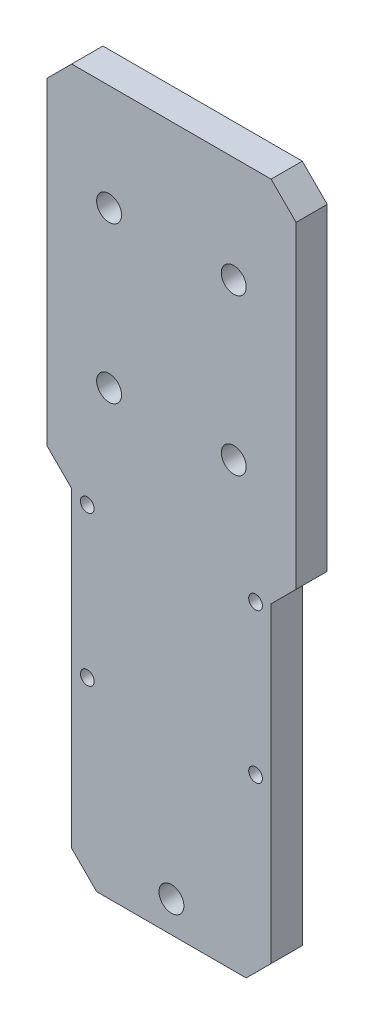
ISO-10303-21;
HEADER;
FILE_DESCRIPTION(('STEP AP214'),'2;1');
FILE_NAME('part.step','',(''),(''),'','','');
FILE_SCHEMA(('AUTOMOTIVE_DESIGN { 1 0 10303 214 1 1 1 1 }'));
ENDSEC;
DATA;
#1=APPLICATION_CONTEXT('core data for automotive mechanical design processes');
#2=APPLICATION_PROTOCOL_DEFINITION('international standard','automotive_design',2000,#1);
#3=PRODUCT_CONTEXT('',#1,'mechanical');
#4=PRODUCT('Part','Part','',(#3));
#5=PRODUCT_RELATED_PRODUCT_CATEGORY('part','',(#4));
#6=PRODUCT_DEFINITION_FORMATION('','',#4);
#7=PRODUCT_DEFINITION_CONTEXT('part definition',#1,'design');
#8=PRODUCT_DEFINITION('design','',#6,#7);
#9=PRODUCT_DEFINITION_SHAPE('','',#8);
#10=(LENGTH_UNIT() NAMED_UNIT(*) SI_UNIT(.MILLI.,.METRE.));
#11=(NAMED_UNIT(*) PLANE_ANGLE_UNIT() SI_UNIT($,.RADIAN.));
#12=(NAMED_UNIT(*) SI_UNIT($,.STERADIAN.) SOLID_ANGLE_UNIT());
#13=UNCERTAINTY_MEASURE_WITH_UNIT(LENGTH_MEASURE(1.E-05),#10,'distance_accuracy_value','');
#14=(GEOMETRIC_REPRESENTATION_CONTEXT(3) GLOBAL_UNCERTAINTY_ASSIGNED_CONTEXT((#13)) GLOBAL_UNIT_ASSIGNED_CONTEXT((#10,
#11,#12)) REPRESENTATION_CONTEXT('',''));
#15=CARTESIAN_POINT('',(0.,0.,0.));
#16=DIRECTION('',(0.,0.,1.));
#17=DIRECTION('',(1.,0.,0.));
#18=AXIS2_PLACEMENT_3D('',#15,#16,#17);
#19=CARTESIAN_POINT('',(0.,0.,5.));
#20=DIRECTION('',(0.,0.,1.));
#21=DIRECTION('',(1.,0.,0.));
#22=AXIS2_PLACEMENT_3D('',#19,#20,#21);
#23=PLANE('',#22);
#24=CARTESIAN_POINT('',(0.,-80.5,5.));
#25=DIRECTION('',(0.,0.,1.));
#26=DIRECTION('',(1.,0.,0.));
#27=AXIS2_PLACEMENT_3D('',#24,#25,#26);
#28=CIRCLE('',#27,2.);
#29=CARTESIAN_POINT('',(2.,-80.5,5.));
#30=VERTEX_POINT('',#29);
#31=EDGE_CURVE('E169',#30,#30,#28,.T.);
#32=ORIENTED_EDGE('',*,*,#31,.F.);
#33=EDGE_LOOP('',(#32));
#34=FACE_BOUND('',#33,.T.);
#35=CARTESIAN_POINT('',(-10.000556095379,-14.500556095379,5.));
#36=DIRECTION('',(0.,0.,-1.));
#37=DIRECTION('',(-1.,0.,0.));
#38=AXIS2_PLACEMENT_3D('',#35,#36,#37);
#39=CIRCLE('',#38,2.);
#40=CARTESIAN_POINT('',(-12.000556095379,-14.500556095379,5.));
#41=VERTEX_POINT('',#40);
#42=EDGE_CURVE('E206',#41,#41,#39,.T.);
#43=ORIENTED_EDGE('',*,*,#42,.T.);
#44=EDGE_LOOP('',(#43));
#45=FACE_BOUND('',#44,.T.);
#46=CARTESIAN_POINT('',(-10.000556095379,10.499443904621,5.));
#47=DIRECTION('',(0.,0.,-1.));
#48=DIRECTION('',(-1.,0.,0.));
#49=AXIS2_PLACEMENT_3D('',#46,#47,#48);
#50=CIRCLE('',#49,2.);
#51=CARTESIAN_POINT('',(-12.000556095379,10.499443904621,5.));
#52=VERTEX_POINT('',#51);
#53=EDGE_CURVE('E193',#52,#52,#50,.T.);
#54=ORIENTED_EDGE('',*,*,#53,.T.);
#55=EDGE_LOOP('',(#54));
#56=FACE_BOUND('',#55,.T.);
#57=DIRECTION('',(0.707106781186552,0.707106781186544,0.));
#58=VECTOR('',#57,1.);
#59=CARTESIAN_POINT('',(-20.,23.4977756184842,5.));
#60=LINE('',#59,#58);
#61=CARTESIAN_POINT('',(-20.,23.4977756184842,5.));
#62=VERTEX_POINT('',#61);
#63=CARTESIAN_POINT('',(-15.9977756184841,27.5,5.));
#64=VERTEX_POINT('',#63);
#65=EDGE_CURVE('E225',#62,#64,#60,.T.);
#66=ORIENTED_EDGE('',*,*,#65,.F.);
#67=DIRECTION('',(0.,-1.,0.));
#68=VECTOR('',#67,1.);
#69=CARTESIAN_POINT('',(-20.,0.,5.));
#70=LINE('',#69,#68);
#71=CARTESIAN_POINT('',(-20.,-27.5,5.));
#72=VERTEX_POINT('',#71);
#73=EDGE_CURVE('E251',#62,#72,#70,.T.);
#74=ORIENTED_EDGE('',*,*,#73,.T.);
#75=DIRECTION('',(0.707106781186546,-0.707106781186549,0.));
#76=VECTOR('',#75,1.);
#77=CARTESIAN_POINT('',(-23.75,-23.75,5.));
#78=LINE('',#77,#76);
#79=CARTESIAN_POINT('',(-16.,-31.5,5.));
#80=VERTEX_POINT('',#79);
#81=EDGE_CURVE('E254',#72,#80,#78,.T.);
#82=ORIENTED_EDGE('',*,*,#81,.T.);
#83=DIRECTION('',(0.,1.,0.));
#84=VECTOR('',#83,1.);
#85=CARTESIAN_POINT('',(-16.,0.,5.));
#86=LINE('',#85,#84);
#87=CARTESIAN_POINT('',(-16.,-81.4977756184842,5.));
#88=VERTEX_POINT('',#87);
#89=EDGE_CURVE('E257',#88,#80,#86,.T.);
#90=ORIENTED_EDGE('',*,*,#89,.F.);
#91=DIRECTION('',(0.707106781186556,-0.707106781186539,0.));
#92=VECTOR('',#91,1.);
#93=CARTESIAN_POINT('',(-48.7488878092419,-48.7488878092431,5.));
#94=LINE('',#93,#92);
#95=CARTESIAN_POINT('',(-11.9977756184841,-85.5,5.));
#96=VERTEX_POINT('',#95);
#97=EDGE_CURVE('E163',#88,#96,#94,.T.);
#98=ORIENTED_EDGE('',*,*,#97,.T.);
#99=DIRECTION('',(1.,0.,0.));
#100=VECTOR('',#99,1.);
#101=CARTESIAN_POINT('',(0.,-85.5,5.));
#102=LINE('',#101,#100);
#103=CARTESIAN_POINT('',(11.9977756184841,-85.5,5.));
#104=VERTEX_POINT('',#103);
#105=EDGE_CURVE('E174',#96,#104,#102,.T.);
#106=ORIENTED_EDGE('',*,*,#105,.T.);
#107=DIRECTION('',(-0.707106781186556,-0.707106781186539,0.));
#108=VECTOR('',#107,1.);
#109=CARTESIAN_POINT('',(48.7488878092419,-48.7488878092431,5.));
#110=LINE('',#109,#108);
#111=CARTESIAN_POINT('',(16.,-81.4977756184842,5.));
#112=VERTEX_POINT('',#111);
#113=EDGE_CURVE('E153',#112,#104,#110,.T.);
#114=ORIENTED_EDGE('',*,*,#113,.F.);
#115=DIRECTION('',(0.,1.,0.));
#116=VECTOR('',#115,1.);
#117=CARTESIAN_POINT('',(16.,0.,5.));
#118=LINE('',#117,#116);
#119=CARTESIAN_POINT('',(16.,-31.5,5.));
#120=VERTEX_POINT('',#119);
#121=EDGE_CURVE('E261',#112,#120,#118,.T.);
#122=ORIENTED_EDGE('',*,*,#121,.T.);
#123=DIRECTION('',(-0.707106781186546,-0.707106781186549,0.));
#124=VECTOR('',#123,1.);
#125=CARTESIAN_POINT('',(23.75,-23.75,5.));
#126=LINE('',#125,#124);
#127=CARTESIAN_POINT('',(20.,-27.5,5.));
#128=VERTEX_POINT('',#127);
#129=EDGE_CURVE('E264',#128,#120,#126,.T.);
#130=ORIENTED_EDGE('',*,*,#129,.F.);
#131=DIRECTION('',(0.,-1.,0.));
#132=VECTOR('',#131,1.);
#133=CARTESIAN_POINT('',(20.,0.,5.));
#134=LINE('',#133,#132);
#135=CARTESIAN_POINT('',(20.,23.4977756184842,5.));
#136=VERTEX_POINT('',#135);
#137=EDGE_CURVE('E243',#136,#128,#134,.T.);
#138=ORIENTED_EDGE('',*,*,#137,.F.);
#139=DIRECTION('',(0.707106781186552,-0.707106781186544,0.));
#140=VECTOR('',#139,1.);
#141=CARTESIAN_POINT('',(20.,23.4977756184842,5.));
#142=LINE('',#141,#140);
#143=CARTESIAN_POINT('',(15.9977756184841,27.5,5.));
#144=VERTEX_POINT('',#143);
#145=EDGE_CURVE('E217',#144,#136,#142,.T.);
#146=ORIENTED_EDGE('',*,*,#145,.F.);
#147=DIRECTION('',(1.,0.,0.));
#148=VECTOR('',#147,1.);
#149=CARTESIAN_POINT('',(0.,27.5,5.));
#150=LINE('',#149,#148);
#151=EDGE_CURVE('E246',#64,#144,#150,.T.);
#152=ORIENTED_EDGE('',*,*,#151,.F.);
#153=EDGE_LOOP('',(#66,#74,#82,#90,#98,#106,#114,#122,#130,#138,#146,#152));
#154=FACE_BOUND('',#153,.T.);
#155=CARTESIAN_POINT('',(13.5,-32.5,5.));
#156=DIRECTION('',(0.,0.,1.));
#157=DIRECTION('',(1.,0.,0.));
#158=AXIS2_PLACEMENT_3D('',#155,#156,#157);
#159=CIRCLE('',#158,1.1);
#160=CARTESIAN_POINT('',(14.6,-32.5,5.));
#161=VERTEX_POINT('',#160);
#162=EDGE_CURVE('E268',#161,#161,#159,.F.);
#163=ORIENTED_EDGE('',*,*,#162,.T.);
#164=EDGE_LOOP('',(#163));
#165=FACE_BOUND('',#164,.T.);
#166=CARTESIAN_POINT('',(13.4999999999998,-56.5,5.));
#167=DIRECTION('',(0.,0.,1.));
#168=DIRECTION('',(1.,0.,0.));
#169=AXIS2_PLACEMENT_3D('',#166,#167,#168);
#170=CIRCLE('',#169,1.10000000000001);
#171=CARTESIAN_POINT('',(14.5999999999998,-56.5,5.));
#172=VERTEX_POINT('',#171);
#173=EDGE_CURVE('E272',#172,#172,#170,.F.);
#174=ORIENTED_EDGE('',*,*,#173,.T.);
#175=EDGE_LOOP('',(#174));
#176=FACE_BOUND('',#175,.T.);
#177=CARTESIAN_POINT('',(-13.4999999999997,-56.5,5.));
#178=DIRECTION('',(0.,0.,1.));
#179=DIRECTION('',(1.,0.,0.));
#180=AXIS2_PLACEMENT_3D('',#177,#178,#179);
#181=CIRCLE('',#180,1.10000000000001);
#182=CARTESIAN_POINT('',(-12.3999999999997,-56.5,5.));
#183=VERTEX_POINT('',#182);
#184=EDGE_CURVE('E276',#183,#183,#181,.T.);
#185=ORIENTED_EDGE('',*,*,#184,.F.);
#186=EDGE_LOOP('',(#185));
#187=FACE_BOUND('',#186,.T.);
#188=CARTESIAN_POINT('',(-13.5,-32.5,5.));
#189=DIRECTION('',(0.,0.,1.));
#190=DIRECTION('',(1.,0.,0.));
#191=AXIS2_PLACEMENT_3D('',#188,#189,#190);
#192=CIRCLE('',#191,1.1);
#193=CARTESIAN_POINT('',(-12.4,-32.5,5.));
#194=VERTEX_POINT('',#193);
#195=EDGE_CURVE('E280',#194,#194,#192,.T.);
#196=ORIENTED_EDGE('',*,*,#195,.F.);
#197=EDGE_LOOP('',(#196));
#198=FACE_BOUND('',#197,.T.);
#199=CARTESIAN_POINT('',(10.000556095379,10.499443904621,5.));
#200=DIRECTION('',(0.,0.,1.));
#201=DIRECTION('',(1.,0.,0.));
#202=AXIS2_PLACEMENT_3D('',#199,#200,#201);
#203=CIRCLE('',#202,2.);
#204=CARTESIAN_POINT('',(12.000556095379,10.499443904621,5.));
#205=VERTEX_POINT('',#204);
#206=EDGE_CURVE('E189',#205,#205,#203,.T.);
#207=ORIENTED_EDGE('',*,*,#206,.F.);
#208=EDGE_LOOP('',(#207));
#209=FACE_BOUND('',#208,.T.);
#210=CARTESIAN_POINT('',(10.000556095379,-14.500556095379,5.));
#211=DIRECTION('',(0.,0.,1.));
#212=DIRECTION('',(1.,0.,0.));
#213=AXIS2_PLACEMENT_3D('',#210,#211,#212);
#214=CIRCLE('',#213,2.);
#215=CARTESIAN_POINT('',(12.000556095379,-14.500556095379,5.));
#216=VERTEX_POINT('',#215);
#217=EDGE_CURVE('E198',#216,#216,#214,.T.);
#218=ORIENTED_EDGE('',*,*,#217,.F.);
#219=EDGE_LOOP('',(#218));
#220=FACE_BOUND('',#219,.T.);
#221=ADVANCED_FACE('F41',(#34,#45,#56,#154,#165,#176,#187,#198,#209,#220),#23,.T.);
#222=CARTESIAN_POINT('',(0.,0.,0.));
#223=DIRECTION('',(0.,0.,1.));
#224=DIRECTION('',(1.,0.,0.));
#225=AXIS2_PLACEMENT_3D('',#222,#223,#224);
#226=PLANE('',#225);
#227=CARTESIAN_POINT('',(0.,-80.5,0.));
#228=DIRECTION('',(0.,0.,1.));
#229=DIRECTION('',(1.,0.,0.));
#230=AXIS2_PLACEMENT_3D('',#227,#228,#229);
#231=CIRCLE('',#230,2.);
#232=CARTESIAN_POINT('',(2.,-80.5,0.));
#233=VERTEX_POINT('',#232);
#234=EDGE_CURVE('E177',#233,#233,#231,.T.);
#235=ORIENTED_EDGE('',*,*,#234,.T.);
#236=EDGE_LOOP('',(#235));
#237=FACE_BOUND('',#236,.T.);
#238=CARTESIAN_POINT('',(-10.000556095379,-14.500556095379,0.));
#239=DIRECTION('',(0.,0.,-1.));
#240=DIRECTION('',(-1.,0.,0.));
#241=AXIS2_PLACEMENT_3D('',#238,#239,#240);
#242=CIRCLE('',#241,2.);
#243=CARTESIAN_POINT('',(-12.000556095379,-14.500556095379,0.));
#244=VERTEX_POINT('',#243);
#245=EDGE_CURVE('E182',#244,#244,#242,.T.);
#246=ORIENTED_EDGE('',*,*,#245,.F.);
#247=EDGE_LOOP('',(#246));
#248=FACE_BOUND('',#247,.T.);
#249=CARTESIAN_POINT('',(10.000556095379,10.499443904621,0.));
#250=DIRECTION('',(0.,0.,1.));
#251=DIRECTION('',(1.,0.,0.));
#252=AXIS2_PLACEMENT_3D('',#249,#250,#251);
#253=CIRCLE('',#252,2.);
#254=CARTESIAN_POINT('',(12.000556095379,10.499443904621,0.));
#255=VERTEX_POINT('',#254);
#256=EDGE_CURVE('E194',#255,#255,#253,.T.);
#257=ORIENTED_EDGE('',*,*,#256,.T.);
#258=EDGE_LOOP('',(#257));
#259=FACE_BOUND('',#258,.T.);
#260=CARTESIAN_POINT('',(-10.000556095379,10.499443904621,0.));
#261=DIRECTION('',(0.,0.,-1.));
#262=DIRECTION('',(-1.,0.,0.));
#263=AXIS2_PLACEMENT_3D('',#260,#261,#262);
#264=CIRCLE('',#263,2.);
#265=CARTESIAN_POINT('',(-12.000556095379,10.499443904621,0.));
#266=VERTEX_POINT('',#265);
#267=EDGE_CURVE('E213',#266,#266,#264,.T.);
#268=ORIENTED_EDGE('',*,*,#267,.F.);
#269=EDGE_LOOP('',(#268));
#270=FACE_BOUND('',#269,.T.);
#271=DIRECTION('',(0.,-1.,0.));
#272=VECTOR('',#271,1.);
#273=CARTESIAN_POINT('',(-20.,0.,0.));
#274=LINE('',#273,#272);
#275=CARTESIAN_POINT('',(-20.,23.4977756184842,0.));
#276=VERTEX_POINT('',#275);
#277=CARTESIAN_POINT('',(-20.,-27.5,0.));
#278=VERTEX_POINT('',#277);
#279=EDGE_CURVE('E291',#276,#278,#274,.T.);
#280=ORIENTED_EDGE('',*,*,#279,.F.);
#281=DIRECTION('',(0.707106781186552,0.707106781186544,0.));
#282=VECTOR('',#281,1.);
#283=CARTESIAN_POINT('',(-20.,23.4977756184842,0.));
#284=LINE('',#283,#282);
#285=CARTESIAN_POINT('',(-15.9977756184841,27.5,0.));
#286=VERTEX_POINT('',#285);
#287=EDGE_CURVE('E221',#276,#286,#284,.T.);
#288=ORIENTED_EDGE('',*,*,#287,.T.);
#289=DIRECTION('',(1.,0.,0.));
#290=VECTOR('',#289,1.);
#291=CARTESIAN_POINT('',(0.,27.5,0.));
#292=LINE('',#291,#290);
#293=CARTESIAN_POINT('',(15.9977756184841,27.5,0.));
#294=VERTEX_POINT('',#293);
#295=EDGE_CURVE('E287',#286,#294,#292,.T.);
#296=ORIENTED_EDGE('',*,*,#295,.T.);
#297=DIRECTION('',(0.707106781186552,-0.707106781186544,0.));
#298=VECTOR('',#297,1.);
#299=CARTESIAN_POINT('',(20.,23.4977756184842,0.));
#300=LINE('',#299,#298);
#301=CARTESIAN_POINT('',(20.,23.4977756184842,0.));
#302=VERTEX_POINT('',#301);
#303=EDGE_CURVE('E233',#294,#302,#300,.T.);
#304=ORIENTED_EDGE('',*,*,#303,.T.);
#305=DIRECTION('',(0.,-1.,0.));
#306=VECTOR('',#305,1.);
#307=CARTESIAN_POINT('',(20.,0.,0.));
#308=LINE('',#307,#306);
#309=CARTESIAN_POINT('',(20.,-27.5,0.));
#310=VERTEX_POINT('',#309);
#311=EDGE_CURVE('E230',#302,#310,#308,.T.);
#312=ORIENTED_EDGE('',*,*,#311,.T.);
#313=DIRECTION('',(-0.707106781186546,-0.707106781186549,0.));
#314=VECTOR('',#313,1.);
#315=CARTESIAN_POINT('',(23.75,-23.75,0.));
#316=LINE('',#315,#314);
#317=CARTESIAN_POINT('',(16.,-31.5,0.));
#318=VERTEX_POINT('',#317);
#319=EDGE_CURVE('E304',#310,#318,#316,.T.);
#320=ORIENTED_EDGE('',*,*,#319,.T.);
#321=DIRECTION('',(0.,1.,0.));
#322=VECTOR('',#321,1.);
#323=CARTESIAN_POINT('',(16.,0.,0.));
#324=LINE('',#323,#322);
#325=CARTESIAN_POINT('',(16.,-81.4977756184842,0.));
#326=VERTEX_POINT('',#325);
#327=EDGE_CURVE('E142',#326,#318,#324,.T.);
#328=ORIENTED_EDGE('',*,*,#327,.F.);
#329=DIRECTION('',(-0.707106781186556,-0.707106781186539,0.));
#330=VECTOR('',#329,1.);
#331=CARTESIAN_POINT('',(48.7488878092419,-48.7488878092431,0.));
#332=LINE('',#331,#330);
#333=CARTESIAN_POINT('',(11.9977756184841,-85.5,0.));
#334=VERTEX_POINT('',#333);
#335=EDGE_CURVE('E131',#326,#334,#332,.T.);
#336=ORIENTED_EDGE('',*,*,#335,.T.);
#337=DIRECTION('',(1.,0.,0.));
#338=VECTOR('',#337,1.);
#339=CARTESIAN_POINT('',(0.,-85.5,0.));
#340=LINE('',#339,#338);
#341=CARTESIAN_POINT('',(-11.9977756184841,-85.5,0.));
#342=VERTEX_POINT('',#341);
#343=EDGE_CURVE('E138',#342,#334,#340,.T.);
#344=ORIENTED_EDGE('',*,*,#343,.F.);
#345=DIRECTION('',(0.707106781186556,-0.707106781186539,0.));
#346=VECTOR('',#345,1.);
#347=CARTESIAN_POINT('',(-48.7488878092419,-48.7488878092431,0.));
#348=LINE('',#347,#346);
#349=CARTESIAN_POINT('',(-16.,-81.4977756184842,0.));
#350=VERTEX_POINT('',#349);
#351=EDGE_CURVE('E147',#350,#342,#348,.T.);
#352=ORIENTED_EDGE('',*,*,#351,.F.);
#353=DIRECTION('',(0.,1.,0.));
#354=VECTOR('',#353,1.);
#355=CARTESIAN_POINT('',(-16.,0.,0.));
#356=LINE('',#355,#354);
#357=CARTESIAN_POINT('',(-16.,-31.5,0.));
#358=VERTEX_POINT('',#357);
#359=EDGE_CURVE('E298',#350,#358,#356,.T.);
#360=ORIENTED_EDGE('',*,*,#359,.T.);
#361=DIRECTION('',(0.707106781186546,-0.707106781186549,0.));
#362=VECTOR('',#361,1.);
#363=CARTESIAN_POINT('',(-23.75,-23.75,0.));
#364=LINE('',#363,#362);
#365=EDGE_CURVE('E294',#278,#358,#364,.T.);
#366=ORIENTED_EDGE('',*,*,#365,.F.);
#367=EDGE_LOOP('',(#280,#288,#296,#304,#312,#320,#328,#336,#344,#352,#360,#366));
#368=FACE_BOUND('',#367,.T.);
#369=CARTESIAN_POINT('',(13.5,-32.5,0.));
#370=DIRECTION('',(0.,0.,1.));
#371=DIRECTION('',(1.,0.,0.));
#372=AXIS2_PLACEMENT_3D('',#369,#370,#371);
#373=CIRCLE('',#372,1.1);
#374=CARTESIAN_POINT('',(14.6,-32.5,0.));
#375=VERTEX_POINT('',#374);
#376=EDGE_CURVE('E307',#375,#375,#373,.F.);
#377=ORIENTED_EDGE('',*,*,#376,.F.);
#378=EDGE_LOOP('',(#377));
#379=FACE_BOUND('',#378,.T.);
#380=CARTESIAN_POINT('',(13.4999999999998,-56.5,0.));
#381=DIRECTION('',(0.,0.,1.));
#382=DIRECTION('',(1.,0.,0.));
#383=AXIS2_PLACEMENT_3D('',#380,#381,#382);
#384=CIRCLE('',#383,1.10000000000001);
#385=CARTESIAN_POINT('',(14.5999999999998,-56.5,0.));
#386=VERTEX_POINT('',#385);
#387=EDGE_CURVE('E311',#386,#386,#384,.F.);
#388=ORIENTED_EDGE('',*,*,#387,.F.);
#389=EDGE_LOOP('',(#388));
#390=FACE_BOUND('',#389,.T.);
#391=CARTESIAN_POINT('',(-13.4999999999997,-56.5,0.));
#392=DIRECTION('',(0.,0.,1.));
#393=DIRECTION('',(1.,0.,0.));
#394=AXIS2_PLACEMENT_3D('',#391,#392,#393);
#395=CIRCLE('',#394,1.10000000000001);
#396=CARTESIAN_POINT('',(-12.3999999999997,-56.5,0.));
#397=VERTEX_POINT('',#396);
#398=EDGE_CURVE('E315',#397,#397,#395,.T.);
#399=ORIENTED_EDGE('',*,*,#398,.T.);
#400=EDGE_LOOP('',(#399));
#401=FACE_BOUND('',#400,.T.);
#402=CARTESIAN_POINT('',(-13.5,-32.5,0.));
#403=DIRECTION('',(0.,0.,1.));
#404=DIRECTION('',(1.,0.,0.));
#405=AXIS2_PLACEMENT_3D('',#402,#403,#404);
#406=CIRCLE('',#405,1.1);
#407=CARTESIAN_POINT('',(-12.4,-32.5,0.));
#408=VERTEX_POINT('',#407);
#409=EDGE_CURVE('E247',#408,#408,#406,.T.);
#410=ORIENTED_EDGE('',*,*,#409,.T.);
#411=EDGE_LOOP('',(#410));
#412=FACE_BOUND('',#411,.T.);
#413=CARTESIAN_POINT('',(10.000556095379,-14.500556095379,0.));
#414=DIRECTION('',(0.,0.,1.));
#415=DIRECTION('',(1.,0.,0.));
#416=AXIS2_PLACEMENT_3D('',#413,#414,#415);
#417=CIRCLE('',#416,2.);
#418=CARTESIAN_POINT('',(12.000556095379,-14.500556095379,0.));
#419=VERTEX_POINT('',#418);
#420=EDGE_CURVE('E202',#419,#419,#417,.T.);
#421=ORIENTED_EDGE('',*,*,#420,.T.);
#422=EDGE_LOOP('',(#421));
#423=FACE_BOUND('',#422,.T.);
#424=ADVANCED_FACE('F134',(#237,#248,#259,#270,#368,#379,#390,#401,#412,#423),#226,.F.);
#425=CARTESIAN_POINT('',(20.,0.,5.));
#426=DIRECTION('',(1.,0.,0.));
#427=DIRECTION('',(0.,1.,0.));
#428=AXIS2_PLACEMENT_3D('',#425,#426,#427);
#429=PLANE('',#428);
#430=DIRECTION('',(0.,0.,1.));
#431=VECTOR('',#430,1.);
#432=CARTESIAN_POINT('',(20.,23.4977756184842,0.));
#433=LINE('',#432,#431);
#434=EDGE_CURVE('E65',#302,#136,#433,.T.);
#435=ORIENTED_EDGE('',*,*,#434,.T.);
#436=ORIENTED_EDGE('',*,*,#137,.T.);
#437=DIRECTION('',(0.,0.,-1.));
#438=VECTOR('',#437,1.);
#439=CARTESIAN_POINT('',(20.,-27.5,5.));
#440=LINE('',#439,#438);
#441=EDGE_CURVE('E284',#128,#310,#440,.T.);
#442=ORIENTED_EDGE('',*,*,#441,.T.);
#443=ORIENTED_EDGE('',*,*,#311,.F.);
#444=EDGE_LOOP('',(#435,#436,#442,#443));
#445=FACE_BOUND('',#444,.T.);
#446=ADVANCED_FACE('F43',(#445),#429,.T.);
#447=CARTESIAN_POINT('',(0.,27.5,5.));
#448=DIRECTION('',(0.,1.,0.));
#449=DIRECTION('',(0.,0.,1.));
#450=AXIS2_PLACEMENT_3D('',#447,#448,#449);
#451=PLANE('',#450);
#452=DIRECTION('',(0.,0.,1.));
#453=VECTOR('',#452,1.);
#454=CARTESIAN_POINT('',(-15.9977756184841,27.5,0.));
#455=LINE('',#454,#453);
#456=EDGE_CURVE('E57',#286,#64,#455,.T.);
#457=ORIENTED_EDGE('',*,*,#456,.T.);
#458=ORIENTED_EDGE('',*,*,#151,.T.);
#459=DIRECTION('',(0.,0.,1.));
#460=VECTOR('',#459,1.);
#461=CARTESIAN_POINT('',(15.9977756184841,27.5,0.));
#462=LINE('',#461,#460);
#463=EDGE_CURVE('E236',#294,#144,#462,.T.);
#464=ORIENTED_EDGE('',*,*,#463,.F.);
#465=ORIENTED_EDGE('',*,*,#295,.F.);
#466=EDGE_LOOP('',(#457,#458,#464,#465));
#467=FACE_BOUND('',#466,.T.);
#468=ADVANCED_FACE('F351',(#467),#451,.T.);
#469=CARTESIAN_POINT('',(-20.,0.,5.));
#470=DIRECTION('',(1.,0.,0.));
#471=DIRECTION('',(0.,1.,0.));
#472=AXIS2_PLACEMENT_3D('',#469,#470,#471);
#473=PLANE('',#472);
#474=ORIENTED_EDGE('',*,*,#73,.F.);
#475=DIRECTION('',(0.,0.,1.));
#476=VECTOR('',#475,1.);
#477=CARTESIAN_POINT('',(-20.,23.4977756184842,0.));
#478=LINE('',#477,#476);
#479=EDGE_CURVE('E224',#276,#62,#478,.T.);
#480=ORIENTED_EDGE('',*,*,#479,.F.);
#481=ORIENTED_EDGE('',*,*,#279,.T.);
#482=DIRECTION('',(0.,0.,-1.));
#483=VECTOR('',#482,1.);
#484=CARTESIAN_POINT('',(-20.,-27.5,5.));
#485=LINE('',#484,#483);
#486=EDGE_CURVE('E11',#72,#278,#485,.T.);
#487=ORIENTED_EDGE('',*,*,#486,.F.);
#488=EDGE_LOOP('',(#474,#480,#481,#487));
#489=FACE_BOUND('',#488,.T.);
#490=ADVANCED_FACE('F347',(#489),#473,.F.);
#491=CARTESIAN_POINT('',(-23.75,-23.75,5.));
#492=DIRECTION('',(0.707106781186549,0.707106781186546,0.));
#493=DIRECTION('',(-0.707106781186546,0.707106781186549,0.));
#494=AXIS2_PLACEMENT_3D('',#491,#492,#493);
#495=PLANE('',#494);
#496=ORIENTED_EDGE('',*,*,#365,.T.);
#497=DIRECTION('',(0.,0.,-1.));
#498=VECTOR('',#497,1.);
#499=CARTESIAN_POINT('',(-16.,-31.5,5.));
#500=LINE('',#499,#498);
#501=EDGE_CURVE('E50',#80,#358,#500,.T.);
#502=ORIENTED_EDGE('',*,*,#501,.F.);
#503=ORIENTED_EDGE('',*,*,#81,.F.);
#504=ORIENTED_EDGE('',*,*,#486,.T.);
#505=EDGE_LOOP('',(#496,#502,#503,#504));
#506=FACE_BOUND('',#505,.T.);
#507=ADVANCED_FACE('F335',(#506),#495,.F.);
#508=CARTESIAN_POINT('',(-16.,0.,5.));
#509=DIRECTION('',(-1.,0.,0.));
#510=DIRECTION('',(0.,0.,1.));
#511=AXIS2_PLACEMENT_3D('',#508,#509,#510);
#512=PLANE('',#511);
#513=ORIENTED_EDGE('',*,*,#359,.F.);
#514=DIRECTION('',(0.,0.,1.));
#515=VECTOR('',#514,1.);
#516=CARTESIAN_POINT('',(-16.,-81.4977756184842,0.));
#517=LINE('',#516,#515);
#518=EDGE_CURVE('E183',#350,#88,#517,.T.);
#519=ORIENTED_EDGE('',*,*,#518,.T.);
#520=ORIENTED_EDGE('',*,*,#89,.T.);
#521=ORIENTED_EDGE('',*,*,#501,.T.);
#522=EDGE_LOOP('',(#513,#519,#520,#521));
#523=FACE_BOUND('',#522,.T.);
#524=ADVANCED_FACE('F330',(#523),#512,.T.);
#525=CARTESIAN_POINT('',(16.,0.,5.));
#526=DIRECTION('',(-1.,0.,0.));
#527=DIRECTION('',(0.,0.,1.));
#528=AXIS2_PLACEMENT_3D('',#525,#526,#527);
#529=PLANE('',#528);
#530=ORIENTED_EDGE('',*,*,#327,.T.);
#531=DIRECTION('',(0.,0.,-1.));
#532=VECTOR('',#531,1.);
#533=CARTESIAN_POINT('',(16.,-31.5,5.));
#534=LINE('',#533,#532);
#535=EDGE_CURVE('E325',#120,#318,#534,.T.);
#536=ORIENTED_EDGE('',*,*,#535,.F.);
#537=ORIENTED_EDGE('',*,*,#121,.F.);
#538=DIRECTION('',(0.,0.,1.));
#539=VECTOR('',#538,1.);
#540=CARTESIAN_POINT('',(16.,-81.4977756184842,0.));
#541=LINE('',#540,#539);
#542=EDGE_CURVE('E158',#326,#112,#541,.T.);
#543=ORIENTED_EDGE('',*,*,#542,.F.);
#544=EDGE_LOOP('',(#530,#536,#537,#543));
#545=FACE_BOUND('',#544,.T.);
#546=ADVANCED_FACE('F364',(#545),#529,.F.);
#547=CARTESIAN_POINT('',(-13.4999999999997,-56.5,5.));
#548=DIRECTION('',(0.,0.,-1.));
#549=DIRECTION('',(-1.,0.,0.));
#550=AXIS2_PLACEMENT_3D('',#547,#548,#549);
#551=CYLINDRICAL_SURFACE('',#550,1.10000000000001);
#552=ORIENTED_EDGE('',*,*,#184,.T.);
#553=EDGE_LOOP('',(#552));
#554=FACE_BOUND('',#553,.T.);
#555=ORIENTED_EDGE('',*,*,#398,.F.);
#556=EDGE_LOOP('',(#555));
#557=FACE_BOUND('',#556,.T.);
#558=ADVANCED_FACE('F366',(#554,#557),#551,.F.);
#559=CARTESIAN_POINT('',(13.4999999999998,-56.5,5.));
#560=DIRECTION('',(0.,0.,-1.));
#561=DIRECTION('',(-1.,0.,0.));
#562=AXIS2_PLACEMENT_3D('',#559,#560,#561);
#563=CYLINDRICAL_SURFACE('',#562,1.10000000000001);
#564=ORIENTED_EDGE('',*,*,#173,.F.);
#565=EDGE_LOOP('',(#564));
#566=FACE_BOUND('',#565,.T.);
#567=ORIENTED_EDGE('',*,*,#387,.T.);
#568=EDGE_LOOP('',(#567));
#569=FACE_BOUND('',#568,.T.);
#570=ADVANCED_FACE('F372',(#566,#569),#563,.F.);
#571=CARTESIAN_POINT('',(13.5,-32.5,5.));
#572=DIRECTION('',(0.,0.,-1.));
#573=DIRECTION('',(-1.,0.,0.));
#574=AXIS2_PLACEMENT_3D('',#571,#572,#573);
#575=CYLINDRICAL_SURFACE('',#574,1.1);
#576=ORIENTED_EDGE('',*,*,#162,.F.);
#577=EDGE_LOOP('',(#576));
#578=FACE_BOUND('',#577,.T.);
#579=ORIENTED_EDGE('',*,*,#376,.T.);
#580=EDGE_LOOP('',(#579));
#581=FACE_BOUND('',#580,.T.);
#582=ADVANCED_FACE('F396',(#578,#581),#575,.F.);
#583=CARTESIAN_POINT('',(23.75,-23.75,5.));
#584=DIRECTION('',(0.707106781186549,-0.707106781186546,0.));
#585=DIRECTION('',(0.707106781186546,0.707106781186549,0.));
#586=AXIS2_PLACEMENT_3D('',#583,#584,#585);
#587=PLANE('',#586);
#588=ORIENTED_EDGE('',*,*,#319,.F.);
#589=ORIENTED_EDGE('',*,*,#441,.F.);
#590=ORIENTED_EDGE('',*,*,#129,.T.);
#591=ORIENTED_EDGE('',*,*,#535,.T.);
#592=EDGE_LOOP('',(#588,#589,#590,#591));
#593=FACE_BOUND('',#592,.T.);
#594=ADVANCED_FACE('F361',(#593),#587,.T.);
#595=CARTESIAN_POINT('',(-13.5,-32.5,5.));
#596=DIRECTION('',(0.,0.,-1.));
#597=DIRECTION('',(-1.,0.,0.));
#598=AXIS2_PLACEMENT_3D('',#595,#596,#597);
#599=CYLINDRICAL_SURFACE('',#598,1.1);
#600=ORIENTED_EDGE('',*,*,#195,.T.);
#601=EDGE_LOOP('',(#600));
#602=FACE_BOUND('',#601,.T.);
#603=ORIENTED_EDGE('',*,*,#409,.F.);
#604=EDGE_LOOP('',(#603));
#605=FACE_BOUND('',#604,.T.);
#606=ADVANCED_FACE('F390',(#602,#605),#599,.F.);
#607=CARTESIAN_POINT('',(20.,23.4977756184842,0.));
#608=DIRECTION('',(-0.707106781186544,-0.707106781186551,0.));
#609=DIRECTION('',(0.707106781186551,-0.707106781186544,0.));
#610=AXIS2_PLACEMENT_3D('',#607,#608,#609);
#611=PLANE('',#610);
#612=ORIENTED_EDGE('',*,*,#145,.T.);
#613=ORIENTED_EDGE('',*,*,#434,.F.);
#614=ORIENTED_EDGE('',*,*,#303,.F.);
#615=ORIENTED_EDGE('',*,*,#463,.T.);
#616=EDGE_LOOP('',(#612,#613,#614,#615));
#617=FACE_BOUND('',#616,.T.);
#618=ADVANCED_FACE('F353',(#617),#611,.F.);
#619=CARTESIAN_POINT('',(-20.,23.4977756184842,0.));
#620=DIRECTION('',(0.707106781186544,-0.707106781186551,0.));
#621=DIRECTION('',(0.707106781186551,0.707106781186544,0.));
#622=AXIS2_PLACEMENT_3D('',#619,#620,#621);
#623=PLANE('',#622);
#624=ORIENTED_EDGE('',*,*,#65,.T.);
#625=ORIENTED_EDGE('',*,*,#456,.F.);
#626=ORIENTED_EDGE('',*,*,#287,.F.);
#627=ORIENTED_EDGE('',*,*,#479,.T.);
#628=EDGE_LOOP('',(#624,#625,#626,#627));
#629=FACE_BOUND('',#628,.T.);
#630=ADVANCED_FACE('F416',(#629),#623,.F.);
#631=CARTESIAN_POINT('',(-10.000556095379,10.499443904621,0.));
#632=DIRECTION('',(0.,0.,1.));
#633=DIRECTION('',(1.,0.,0.));
#634=AXIS2_PLACEMENT_3D('',#631,#632,#633);
#635=CYLINDRICAL_SURFACE('',#634,2.);
#636=ORIENTED_EDGE('',*,*,#267,.T.);
#637=EDGE_LOOP('',(#636));
#638=FACE_BOUND('',#637,.T.);
#639=ORIENTED_EDGE('',*,*,#53,.F.);
#640=EDGE_LOOP('',(#639));
#641=FACE_BOUND('',#640,.T.);
#642=ADVANCED_FACE('F423',(#638,#641),#635,.F.);
#643=CARTESIAN_POINT('',(10.000556095379,10.499443904621,0.));
#644=DIRECTION('',(0.,0.,1.));
#645=DIRECTION('',(1.,0.,0.));
#646=AXIS2_PLACEMENT_3D('',#643,#644,#645);
#647=CYLINDRICAL_SURFACE('',#646,2.);
#648=ORIENTED_EDGE('',*,*,#256,.F.);
#649=EDGE_LOOP('',(#648));
#650=FACE_BOUND('',#649,.T.);
#651=ORIENTED_EDGE('',*,*,#206,.T.);
#652=EDGE_LOOP('',(#651));
#653=FACE_BOUND('',#652,.T.);
#654=ADVANCED_FACE('F429',(#650,#653),#647,.F.);
#655=CARTESIAN_POINT('',(10.000556095379,-14.500556095379,0.));
#656=DIRECTION('',(0.,0.,1.));
#657=DIRECTION('',(1.,0.,0.));
#658=AXIS2_PLACEMENT_3D('',#655,#656,#657);
#659=CYLINDRICAL_SURFACE('',#658,2.);
#660=ORIENTED_EDGE('',*,*,#420,.F.);
#661=EDGE_LOOP('',(#660));
#662=FACE_BOUND('',#661,.T.);
#663=ORIENTED_EDGE('',*,*,#217,.T.);
#664=EDGE_LOOP('',(#663));
#665=FACE_BOUND('',#664,.T.);
#666=ADVANCED_FACE('F437',(#662,#665),#659,.F.);
#667=CARTESIAN_POINT('',(-10.000556095379,-14.500556095379,0.));
#668=DIRECTION('',(0.,0.,1.));
#669=DIRECTION('',(1.,0.,0.));
#670=AXIS2_PLACEMENT_3D('',#667,#668,#669);
#671=CYLINDRICAL_SURFACE('',#670,2.);
#672=ORIENTED_EDGE('',*,*,#245,.T.);
#673=EDGE_LOOP('',(#672));
#674=FACE_BOUND('',#673,.T.);
#675=ORIENTED_EDGE('',*,*,#42,.F.);
#676=EDGE_LOOP('',(#675));
#677=FACE_BOUND('',#676,.T.);
#678=ADVANCED_FACE('F445',(#674,#677),#671,.F.);
#679=CARTESIAN_POINT('',(0.,-85.5,0.));
#680=DIRECTION('',(0.,-1.,0.));
#681=DIRECTION('',(0.,0.,-1.));
#682=AXIS2_PLACEMENT_3D('',#679,#680,#681);
#683=PLANE('',#682);
#684=ORIENTED_EDGE('',*,*,#105,.F.);
#685=DIRECTION('',(0.,0.,1.));
#686=VECTOR('',#685,1.);
#687=CARTESIAN_POINT('',(-11.9977756184841,-85.5,0.));
#688=LINE('',#687,#686);
#689=EDGE_CURVE('E161',#342,#96,#688,.T.);
#690=ORIENTED_EDGE('',*,*,#689,.F.);
#691=ORIENTED_EDGE('',*,*,#343,.T.);
#692=DIRECTION('',(0.,0.,1.));
#693=VECTOR('',#692,1.);
#694=CARTESIAN_POINT('',(11.9977756184841,-85.5,0.));
#695=LINE('',#694,#693);
#696=EDGE_CURVE('E150',#334,#104,#695,.T.);
#697=ORIENTED_EDGE('',*,*,#696,.T.);
#698=EDGE_LOOP('',(#684,#690,#691,#697));
#699=FACE_BOUND('',#698,.T.);
#700=ADVANCED_FACE('F160',(#699),#683,.T.);
#701=CARTESIAN_POINT('',(-48.7488878092419,-48.7488878092431,0.));
#702=DIRECTION('',(-0.707106781186539,-0.707106781186556,0.));
#703=DIRECTION('',(0.707106781186556,-0.707106781186539,0.));
#704=AXIS2_PLACEMENT_3D('',#701,#702,#703);
#705=PLANE('',#704);
#706=ORIENTED_EDGE('',*,*,#97,.F.);
#707=ORIENTED_EDGE('',*,*,#518,.F.);
#708=ORIENTED_EDGE('',*,*,#351,.T.);
#709=ORIENTED_EDGE('',*,*,#689,.T.);
#710=EDGE_LOOP('',(#706,#707,#708,#709));
#711=FACE_BOUND('',#710,.T.);
#712=ADVANCED_FACE('F339',(#711),#705,.T.);
#713=CARTESIAN_POINT('',(48.7488878092419,-48.7488878092431,0.));
#714=DIRECTION('',(-0.707106781186539,0.707106781186556,0.));
#715=DIRECTION('',(-0.707106781186556,-0.707106781186539,0.));
#716=AXIS2_PLACEMENT_3D('',#713,#714,#715);
#717=PLANE('',#716);
#718=ORIENTED_EDGE('',*,*,#113,.T.);
#719=ORIENTED_EDGE('',*,*,#696,.F.);
#720=ORIENTED_EDGE('',*,*,#335,.F.);
#721=ORIENTED_EDGE('',*,*,#542,.T.);
#722=EDGE_LOOP('',(#718,#719,#720,#721));
#723=FACE_BOUND('',#722,.T.);
#724=ADVANCED_FACE('F151',(#723),#717,.F.);
#725=CARTESIAN_POINT('',(0.,-80.5,0.));
#726=DIRECTION('',(0.,0.,1.));
#727=DIRECTION('',(1.,0.,0.));
#728=AXIS2_PLACEMENT_3D('',#725,#726,#727);
#729=CYLINDRICAL_SURFACE('',#728,2.);
#730=ORIENTED_EDGE('',*,*,#234,.F.);
#731=EDGE_LOOP('',(#730));
#732=FACE_BOUND('',#731,.T.);
#733=ORIENTED_EDGE('',*,*,#31,.T.);
#734=EDGE_LOOP('',(#733));
#735=FACE_BOUND('',#734,.T.);
#736=ADVANCED_FACE('F473',(#732,#735),#729,.F.);
#737=CLOSED_SHELL('',(#221,#424,#446,#468,#490,#507,#524,#546,#558,#570,#582,#594,#606,#618,
#630,#642,#654,#666,#678,#700,#712,#724,#736));
#738=MANIFOLD_SOLID_BREP('B2',#737);
#739=ADVANCED_BREP_SHAPE_REPRESENTATION('',(#18,#738),#14);
#740=SHAPE_DEFINITION_REPRESENTATION(#9,#739);
ENDSEC;
END-ISO-10303-21;
